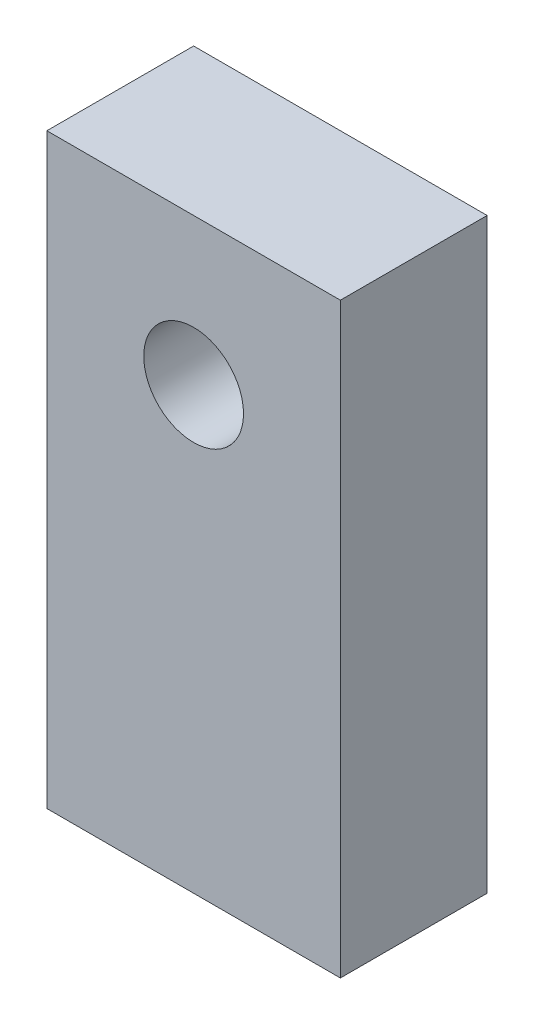
ISO-10303-21;
HEADER;
FILE_DESCRIPTION(('STEP AP214'),'2;1');
FILE_NAME('part.step','',(''),(''),'','','');
FILE_SCHEMA(('AUTOMOTIVE_DESIGN { 1 0 10303 214 1 1 1 1 }'));
ENDSEC;
DATA;
#1=APPLICATION_CONTEXT('core data for automotive mechanical design processes');
#2=APPLICATION_PROTOCOL_DEFINITION('international standard','automotive_design',2000,#1);
#3=PRODUCT_CONTEXT('',#1,'mechanical');
#4=PRODUCT('Part','Part','',(#3));
#5=PRODUCT_RELATED_PRODUCT_CATEGORY('part','',(#4));
#6=PRODUCT_DEFINITION_FORMATION('','',#4);
#7=PRODUCT_DEFINITION_CONTEXT('part definition',#1,'design');
#8=PRODUCT_DEFINITION('design','',#6,#7);
#9=PRODUCT_DEFINITION_SHAPE('','',#8);
#10=(LENGTH_UNIT() NAMED_UNIT(*) SI_UNIT(.MILLI.,.METRE.));
#11=(NAMED_UNIT(*) PLANE_ANGLE_UNIT() SI_UNIT($,.RADIAN.));
#12=(NAMED_UNIT(*) SI_UNIT($,.STERADIAN.) SOLID_ANGLE_UNIT());
#13=UNCERTAINTY_MEASURE_WITH_UNIT(LENGTH_MEASURE(1.E-05),#10,'distance_accuracy_value','');
#14=(GEOMETRIC_REPRESENTATION_CONTEXT(3) GLOBAL_UNCERTAINTY_ASSIGNED_CONTEXT((#13)) GLOBAL_UNIT_ASSIGNED_CONTEXT((#10,
#11,#12)) REPRESENTATION_CONTEXT('',''));
#15=CARTESIAN_POINT('',(0.,0.,0.));
#16=DIRECTION('',(0.,0.,1.));
#17=DIRECTION('',(1.,0.,0.));
#18=AXIS2_PLACEMENT_3D('',#15,#16,#17);
#19=CARTESIAN_POINT('',(-15.,15.,7.5));
#20=DIRECTION('',(1.,0.,0.));
#21=DIRECTION('',(0.,1.,0.));
#22=AXIS2_PLACEMENT_3D('',#19,#20,#21);
#23=PLANE('',#22);
#24=DIRECTION('',(0.,-1.,0.));
#25=VECTOR('',#24,1.);
#26=CARTESIAN_POINT('',(-15.,15.,-7.5));
#27=LINE('',#26,#25);
#28=CARTESIAN_POINT('',(-15.,15.,-7.5));
#29=VERTEX_POINT('',#28);
#30=CARTESIAN_POINT('',(-15.,-45.,-7.5));
#31=VERTEX_POINT('',#30);
#32=EDGE_CURVE('E111',#29,#31,#27,.T.);
#33=ORIENTED_EDGE('',*,*,#32,.T.);
#34=DIRECTION('',(0.,0.,-1.));
#35=VECTOR('',#34,1.);
#36=CARTESIAN_POINT('',(-15.,-45.,7.5));
#37=LINE('',#36,#35);
#38=CARTESIAN_POINT('',(-15.,-45.,7.5));
#39=VERTEX_POINT('',#38);
#40=EDGE_CURVE('E11',#39,#31,#37,.T.);
#41=ORIENTED_EDGE('',*,*,#40,.F.);
#42=DIRECTION('',(0.,-1.,0.));
#43=VECTOR('',#42,1.);
#44=CARTESIAN_POINT('',(-15.,15.,7.5));
#45=LINE('',#44,#43);
#46=CARTESIAN_POINT('',(-15.,15.,7.5));
#47=VERTEX_POINT('',#46);
#48=EDGE_CURVE('E95',#47,#39,#45,.T.);
#49=ORIENTED_EDGE('',*,*,#48,.F.);
#50=DIRECTION('',(0.,0.,-1.));
#51=VECTOR('',#50,1.);
#52=CARTESIAN_POINT('',(-15.,15.,7.5));
#53=LINE('',#52,#51);
#54=EDGE_CURVE('E107',#47,#29,#53,.T.);
#55=ORIENTED_EDGE('',*,*,#54,.T.);
#56=EDGE_LOOP('',(#33,#41,#49,#55));
#57=FACE_BOUND('',#56,.T.);
#58=ADVANCED_FACE('F43',(#57),#23,.F.);
#59=CARTESIAN_POINT('',(-15.,-45.,7.5));
#60=DIRECTION('',(0.,1.,0.));
#61=DIRECTION('',(0.,0.,1.));
#62=AXIS2_PLACEMENT_3D('',#59,#60,#61);
#63=PLANE('',#62);
#64=DIRECTION('',(1.,0.,0.));
#65=VECTOR('',#64,1.);
#66=CARTESIAN_POINT('',(-15.,-45.,-7.5));
#67=LINE('',#66,#65);
#68=CARTESIAN_POINT('',(15.,-45.,-7.5));
#69=VERTEX_POINT('',#68);
#70=EDGE_CURVE('E100',#31,#69,#67,.T.);
#71=ORIENTED_EDGE('',*,*,#70,.T.);
#72=DIRECTION('',(0.,0.,-1.));
#73=VECTOR('',#72,1.);
#74=CARTESIAN_POINT('',(15.,-45.,7.5));
#75=LINE('',#74,#73);
#76=CARTESIAN_POINT('',(15.,-45.,7.5));
#77=VERTEX_POINT('',#76);
#78=EDGE_CURVE('E52',#77,#69,#75,.T.);
#79=ORIENTED_EDGE('',*,*,#78,.F.);
#80=DIRECTION('',(1.,0.,0.));
#81=VECTOR('',#80,1.);
#82=CARTESIAN_POINT('',(-15.,-45.,7.5));
#83=LINE('',#82,#81);
#84=EDGE_CURVE('E90',#39,#77,#83,.T.);
#85=ORIENTED_EDGE('',*,*,#84,.F.);
#86=ORIENTED_EDGE('',*,*,#40,.T.);
#87=EDGE_LOOP('',(#71,#79,#85,#86));
#88=FACE_BOUND('',#87,.T.);
#89=ADVANCED_FACE('F99',(#88),#63,.F.);
#90=CARTESIAN_POINT('',(15.,15.,7.5));
#91=DIRECTION('',(-1.,0.,0.));
#92=DIRECTION('',(0.,-1.,0.));
#93=AXIS2_PLACEMENT_3D('',#90,#91,#92);
#94=PLANE('',#93);
#95=DIRECTION('',(0.,1.,0.));
#96=VECTOR('',#95,1.);
#97=CARTESIAN_POINT('',(15.,15.,-7.5));
#98=LINE('',#97,#96);
#99=CARTESIAN_POINT('',(15.,15.,-7.5));
#100=VERTEX_POINT('',#99);
#101=EDGE_CURVE('E77',#69,#100,#98,.T.);
#102=ORIENTED_EDGE('',*,*,#101,.T.);
#103=DIRECTION('',(0.,0.,-1.));
#104=VECTOR('',#103,1.);
#105=CARTESIAN_POINT('',(15.,15.,7.5));
#106=LINE('',#105,#104);
#107=CARTESIAN_POINT('',(15.,15.,7.5));
#108=VERTEX_POINT('',#107);
#109=EDGE_CURVE('E102',#108,#100,#106,.T.);
#110=ORIENTED_EDGE('',*,*,#109,.F.);
#111=DIRECTION('',(0.,1.,0.));
#112=VECTOR('',#111,1.);
#113=CARTESIAN_POINT('',(15.,15.,7.5));
#114=LINE('',#113,#112);
#115=EDGE_CURVE('E93',#77,#108,#114,.T.);
#116=ORIENTED_EDGE('',*,*,#115,.F.);
#117=ORIENTED_EDGE('',*,*,#78,.T.);
#118=EDGE_LOOP('',(#102,#110,#116,#117));
#119=FACE_BOUND('',#118,.T.);
#120=ADVANCED_FACE('F103',(#119),#94,.F.);
#121=CARTESIAN_POINT('',(-15.,15.,7.5));
#122=DIRECTION('',(0.,-1.,0.));
#123=DIRECTION('',(0.,0.,-1.));
#124=AXIS2_PLACEMENT_3D('',#121,#122,#123);
#125=PLANE('',#124);
#126=DIRECTION('',(-1.,0.,0.));
#127=VECTOR('',#126,1.);
#128=CARTESIAN_POINT('',(-15.,15.,-7.5));
#129=LINE('',#128,#127);
#130=EDGE_CURVE('E83',#100,#29,#129,.T.);
#131=ORIENTED_EDGE('',*,*,#130,.T.);
#132=ORIENTED_EDGE('',*,*,#54,.F.);
#133=DIRECTION('',(-1.,0.,0.));
#134=VECTOR('',#133,1.);
#135=CARTESIAN_POINT('',(-15.,15.,7.5));
#136=LINE('',#135,#134);
#137=EDGE_CURVE('E60',#108,#47,#136,.T.);
#138=ORIENTED_EDGE('',*,*,#137,.F.);
#139=ORIENTED_EDGE('',*,*,#109,.T.);
#140=EDGE_LOOP('',(#131,#132,#138,#139));
#141=FACE_BOUND('',#140,.T.);
#142=ADVANCED_FACE('F125',(#141),#125,.F.);
#143=CARTESIAN_POINT('',(0.,0.,7.5));
#144=DIRECTION('',(0.,0.,1.));
#145=DIRECTION('',(1.,0.,0.));
#146=AXIS2_PLACEMENT_3D('',#143,#144,#145);
#147=PLANE('',#146);
#148=CARTESIAN_POINT('',(0.,0.,7.5));
#149=DIRECTION('',(0.,0.,1.));
#150=DIRECTION('',(1.,0.,0.));
#151=AXIS2_PLACEMENT_3D('',#148,#149,#150);
#152=CIRCLE('',#151,5.1);
#153=CARTESIAN_POINT('',(5.1,0.,7.5));
#154=VERTEX_POINT('',#153);
#155=EDGE_CURVE('E135',#154,#154,#152,.T.);
#156=ORIENTED_EDGE('',*,*,#155,.F.);
#157=EDGE_LOOP('',(#156));
#158=FACE_BOUND('',#157,.T.);
#159=ORIENTED_EDGE('',*,*,#48,.T.);
#160=ORIENTED_EDGE('',*,*,#84,.T.);
#161=ORIENTED_EDGE('',*,*,#115,.T.);
#162=ORIENTED_EDGE('',*,*,#137,.T.);
#163=EDGE_LOOP('',(#159,#160,#161,#162));
#164=FACE_BOUND('',#163,.T.);
#165=ADVANCED_FACE('F91',(#158,#164),#147,.T.);
#166=CARTESIAN_POINT('',(0.,0.,-7.5));
#167=DIRECTION('',(0.,0.,1.));
#168=DIRECTION('',(1.,0.,0.));
#169=AXIS2_PLACEMENT_3D('',#166,#167,#168);
#170=PLANE('',#169);
#171=CARTESIAN_POINT('',(0.,0.,-7.5));
#172=DIRECTION('',(0.,0.,1.));
#173=DIRECTION('',(1.,0.,0.));
#174=AXIS2_PLACEMENT_3D('',#171,#172,#173);
#175=CIRCLE('',#174,5.1);
#176=CARTESIAN_POINT('',(5.1,0.,-7.5));
#177=VERTEX_POINT('',#176);
#178=EDGE_CURVE('E115',#177,#177,#175,.T.);
#179=ORIENTED_EDGE('',*,*,#178,.T.);
#180=EDGE_LOOP('',(#179));
#181=FACE_BOUND('',#180,.T.);
#182=ORIENTED_EDGE('',*,*,#32,.F.);
#183=ORIENTED_EDGE('',*,*,#130,.F.);
#184=ORIENTED_EDGE('',*,*,#101,.F.);
#185=ORIENTED_EDGE('',*,*,#70,.F.);
#186=EDGE_LOOP('',(#182,#183,#184,#185));
#187=FACE_BOUND('',#186,.T.);
#188=ADVANCED_FACE('F128',(#181,#187),#170,.F.);
#189=CARTESIAN_POINT('',(0.,0.,-7.5));
#190=DIRECTION('',(0.,0.,1.));
#191=DIRECTION('',(1.,0.,0.));
#192=AXIS2_PLACEMENT_3D('',#189,#190,#191);
#193=CYLINDRICAL_SURFACE('',#192,5.1);
#194=ORIENTED_EDGE('',*,*,#178,.F.);
#195=EDGE_LOOP('',(#194));
#196=FACE_BOUND('',#195,.T.);
#197=ORIENTED_EDGE('',*,*,#155,.T.);
#198=EDGE_LOOP('',(#197));
#199=FACE_BOUND('',#198,.T.);
#200=ADVANCED_FACE('F140',(#196,#199),#193,.F.);
#201=CLOSED_SHELL('',(#58,#89,#120,#142,#165,#188,#200));
#202=MANIFOLD_SOLID_BREP('B2',#201);
#203=ADVANCED_BREP_SHAPE_REPRESENTATION('',(#18,#202),#14);
#204=SHAPE_DEFINITION_REPRESENTATION(#9,#203);
ENDSEC;
END-ISO-10303-21;
